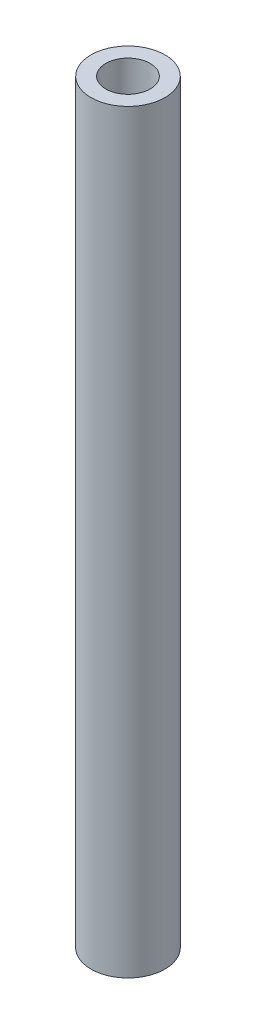
ISO-10303-21;
HEADER;
FILE_DESCRIPTION(('STEP AP214'),'2;1');
FILE_NAME('part.step','',(''),(''),'','','');
FILE_SCHEMA(('AUTOMOTIVE_DESIGN { 1 0 10303 214 1 1 1 1 }'));
ENDSEC;
DATA;
#1=APPLICATION_CONTEXT('core data for automotive mechanical design processes');
#2=APPLICATION_PROTOCOL_DEFINITION('international standard','automotive_design',2000,#1);
#3=PRODUCT_CONTEXT('',#1,'mechanical');
#4=PRODUCT('Part','Part','',(#3));
#5=PRODUCT_RELATED_PRODUCT_CATEGORY('part','',(#4));
#6=PRODUCT_DEFINITION_FORMATION('','',#4);
#7=PRODUCT_DEFINITION_CONTEXT('part definition',#1,'design');
#8=PRODUCT_DEFINITION('design','',#6,#7);
#9=PRODUCT_DEFINITION_SHAPE('','',#8);
#10=(LENGTH_UNIT() NAMED_UNIT(*) SI_UNIT(.MILLI.,.METRE.));
#11=(NAMED_UNIT(*) PLANE_ANGLE_UNIT() SI_UNIT($,.RADIAN.));
#12=(NAMED_UNIT(*) SI_UNIT($,.STERADIAN.) SOLID_ANGLE_UNIT());
#13=UNCERTAINTY_MEASURE_WITH_UNIT(LENGTH_MEASURE(1.E-05),#10,'distance_accuracy_value','');
#14=(GEOMETRIC_REPRESENTATION_CONTEXT(3) GLOBAL_UNCERTAINTY_ASSIGNED_CONTEXT((#13)) GLOBAL_UNIT_ASSIGNED_CONTEXT((#10,
#11,#12)) REPRESENTATION_CONTEXT('',''));
#15=CARTESIAN_POINT('',(0.,0.,0.));
#16=DIRECTION('',(0.,0.,1.));
#17=DIRECTION('',(1.,0.,0.));
#18=AXIS2_PLACEMENT_3D('',#15,#16,#17);
#19=CARTESIAN_POINT('',(0.,51.,0.));
#20=DIRECTION('',(0.,1.,0.));
#21=DIRECTION('',(0.,0.,1.));
#22=AXIS2_PLACEMENT_3D('',#19,#20,#21);
#23=PLANE('',#22);
#24=CARTESIAN_POINT('',(0.,51.,0.));
#25=DIRECTION('',(0.,1.,0.));
#26=DIRECTION('',(0.,0.,1.));
#27=AXIS2_PLACEMENT_3D('',#24,#25,#26);
#28=CIRCLE('',#27,2.5);
#29=CARTESIAN_POINT('',(0.,51.,2.5));
#30=VERTEX_POINT('',#29);
#31=EDGE_CURVE('E10',#30,#30,#28,.T.);
#32=ORIENTED_EDGE('',*,*,#31,.T.);
#33=EDGE_LOOP('',(#32));
#34=FACE_BOUND('',#33,.T.);
#35=CARTESIAN_POINT('',(0.,51.,0.));
#36=DIRECTION('',(0.,1.,0.));
#37=DIRECTION('',(0.,0.,1.));
#38=AXIS2_PLACEMENT_3D('',#35,#36,#37);
#39=CIRCLE('',#38,1.5);
#40=CARTESIAN_POINT('',(0.,51.,1.5));
#41=VERTEX_POINT('',#40);
#42=EDGE_CURVE('E52',#41,#41,#39,.T.);
#43=ORIENTED_EDGE('',*,*,#42,.F.);
#44=EDGE_LOOP('',(#43));
#45=FACE_BOUND('',#44,.T.);
#46=ADVANCED_FACE('F39',(#34,#45),#23,.T.);
#47=CARTESIAN_POINT('',(0.,0.,0.));
#48=DIRECTION('',(0.,1.,0.));
#49=DIRECTION('',(0.,0.,1.));
#50=AXIS2_PLACEMENT_3D('',#47,#48,#49);
#51=PLANE('',#50);
#52=CARTESIAN_POINT('',(0.,0.,0.));
#53=DIRECTION('',(0.,1.,0.));
#54=DIRECTION('',(0.,0.,1.));
#55=AXIS2_PLACEMENT_3D('',#52,#53,#54);
#56=CIRCLE('',#55,2.5);
#57=CARTESIAN_POINT('',(0.,0.,2.5));
#58=VERTEX_POINT('',#57);
#59=EDGE_CURVE('E43',#58,#58,#56,.T.);
#60=ORIENTED_EDGE('',*,*,#59,.F.);
#61=EDGE_LOOP('',(#60));
#62=FACE_BOUND('',#61,.T.);
#63=CARTESIAN_POINT('',(0.,0.,0.));
#64=DIRECTION('',(0.,1.,0.));
#65=DIRECTION('',(0.,0.,1.));
#66=AXIS2_PLACEMENT_3D('',#63,#64,#65);
#67=CIRCLE('',#66,1.5);
#68=CARTESIAN_POINT('',(0.,0.,1.5));
#69=VERTEX_POINT('',#68);
#70=EDGE_CURVE('E54',#69,#69,#67,.T.);
#71=ORIENTED_EDGE('',*,*,#70,.T.);
#72=EDGE_LOOP('',(#71));
#73=FACE_BOUND('',#72,.T.);
#74=ADVANCED_FACE('F66',(#62,#73),#51,.F.);
#75=CARTESIAN_POINT('',(0.,51.,0.));
#76=DIRECTION('',(0.,-1.,0.));
#77=DIRECTION('',(0.,0.,-1.));
#78=AXIS2_PLACEMENT_3D('',#75,#76,#77);
#79=CYLINDRICAL_SURFACE('',#78,2.5);
#80=ORIENTED_EDGE('',*,*,#31,.F.);
#81=EDGE_LOOP('',(#80));
#82=FACE_BOUND('',#81,.T.);
#83=ORIENTED_EDGE('',*,*,#59,.T.);
#84=EDGE_LOOP('',(#83));
#85=FACE_BOUND('',#84,.T.);
#86=ADVANCED_FACE('F41',(#82,#85),#79,.T.);
#87=CARTESIAN_POINT('',(0.,51.,0.));
#88=DIRECTION('',(0.,-1.,0.));
#89=DIRECTION('',(0.,0.,-1.));
#90=AXIS2_PLACEMENT_3D('',#87,#88,#89);
#91=CYLINDRICAL_SURFACE('',#90,1.5);
#92=ORIENTED_EDGE('',*,*,#42,.T.);
#93=EDGE_LOOP('',(#92));
#94=FACE_BOUND('',#93,.T.);
#95=ORIENTED_EDGE('',*,*,#70,.F.);
#96=EDGE_LOOP('',(#95));
#97=FACE_BOUND('',#96,.T.);
#98=ADVANCED_FACE('F62',(#94,#97),#91,.F.);
#99=CLOSED_SHELL('',(#46,#74,#86,#98));
#100=MANIFOLD_SOLID_BREP('B2',#99);
#101=ADVANCED_BREP_SHAPE_REPRESENTATION('',(#18,#100),#14);
#102=SHAPE_DEFINITION_REPRESENTATION(#9,#101);
ENDSEC;
END-ISO-10303-21;
